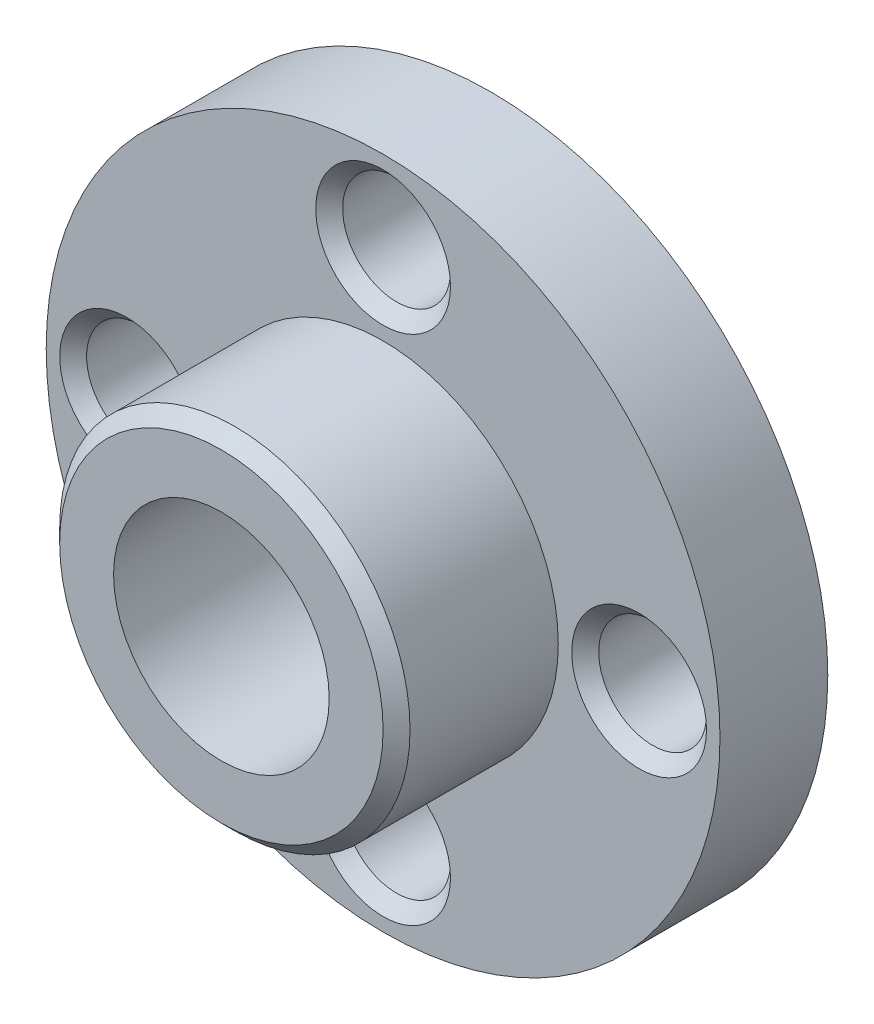
ISO-10303-21;
HEADER;
FILE_DESCRIPTION(('STEP AP214'),'2;1');
FILE_NAME('part.step','',(''),(''),'','','');
FILE_SCHEMA(('AUTOMOTIVE_DESIGN { 1 0 10303 214 1 1 1 1 }'));
ENDSEC;
DATA;
#1=APPLICATION_CONTEXT('core data for automotive mechanical design processes');
#2=APPLICATION_PROTOCOL_DEFINITION('international standard','automotive_design',2000,#1);
#3=PRODUCT_CONTEXT('',#1,'mechanical');
#4=PRODUCT('Part','Part','',(#3));
#5=PRODUCT_RELATED_PRODUCT_CATEGORY('part','',(#4));
#6=PRODUCT_DEFINITION_FORMATION('','',#4);
#7=PRODUCT_DEFINITION_CONTEXT('part definition',#1,'design');
#8=PRODUCT_DEFINITION('design','',#6,#7);
#9=PRODUCT_DEFINITION_SHAPE('','',#8);
#10=(LENGTH_UNIT() NAMED_UNIT(*) SI_UNIT(.MILLI.,.METRE.));
#11=(NAMED_UNIT(*) PLANE_ANGLE_UNIT() SI_UNIT($,.RADIAN.));
#12=(NAMED_UNIT(*) SI_UNIT($,.STERADIAN.) SOLID_ANGLE_UNIT());
#13=UNCERTAINTY_MEASURE_WITH_UNIT(LENGTH_MEASURE(1.E-05),#10,'distance_accuracy_value','');
#14=(GEOMETRIC_REPRESENTATION_CONTEXT(3) GLOBAL_UNCERTAINTY_ASSIGNED_CONTEXT((#13)) GLOBAL_UNIT_ASSIGNED_CONTEXT((#10,
#11,#12)) REPRESENTATION_CONTEXT('',''));
#15=CARTESIAN_POINT('',(0.,0.,0.));
#16=DIRECTION('',(0.,0.,1.));
#17=DIRECTION('',(1.,0.,0.));
#18=AXIS2_PLACEMENT_3D('',#15,#16,#17);
#19=CARTESIAN_POINT('',(0.,0.,9.50000000000273));
#20=DIRECTION('',(0.,0.,-1.));
#21=DIRECTION('',(-1.,0.,0.));
#22=AXIS2_PLACEMENT_3D('',#19,#20,#21);
#23=CONICAL_SURFACE('',#22,6.50000000001683,0.785398163397448);
#24=CARTESIAN_POINT('',(0.,0.,9.5));
#25=DIRECTION('',(0.,0.,1.));
#26=DIRECTION('',(1.,0.,0.));
#27=AXIS2_PLACEMENT_3D('',#24,#25,#26);
#28=CIRCLE('',#27,6.5);
#29=CARTESIAN_POINT('',(6.5,0.,9.5));
#30=VERTEX_POINT('',#29);
#31=EDGE_CURVE('E42',#30,#30,#28,.F.);
#32=ORIENTED_EDGE('',*,*,#31,.F.);
#33=EDGE_LOOP('',(#32));
#34=FACE_BOUND('',#33,.T.);
#35=CARTESIAN_POINT('',(0.,0.,9.99999999999091));
#36=DIRECTION('',(0.,0.,-1.));
#37=DIRECTION('',(-1.,0.,0.));
#38=AXIS2_PLACEMENT_3D('',#35,#36,#37);
#39=CIRCLE('',#38,6.00000000002865);
#40=CARTESIAN_POINT('',(-6.00000000002865,0.,9.99999999999091));
#41=VERTEX_POINT('',#40);
#42=EDGE_CURVE('E25',#41,#41,#39,.F.);
#43=ORIENTED_EDGE('',*,*,#42,.F.);
#44=EDGE_LOOP('',(#43));
#45=FACE_BOUND('',#44,.T.);
#46=ADVANCED_FACE('F22',(#34,#45),#23,.T.);
#47=CARTESIAN_POINT('',(0.,0.,0.));
#48=DIRECTION('',(0.,0.,1.));
#49=DIRECTION('',(1.,0.,0.));
#50=AXIS2_PLACEMENT_3D('',#47,#48,#49);
#51=CYLINDRICAL_SURFACE('',#50,6.5);
#52=CARTESIAN_POINT('',(0.,0.,4.));
#53=DIRECTION('',(0.,0.,1.));
#54=DIRECTION('',(1.,0.,0.));
#55=AXIS2_PLACEMENT_3D('',#52,#53,#54);
#56=CIRCLE('',#55,6.5);
#57=CARTESIAN_POINT('',(6.5,0.,4.));
#58=VERTEX_POINT('',#57);
#59=EDGE_CURVE('E82',#58,#58,#56,.F.);
#60=ORIENTED_EDGE('',*,*,#59,.F.);
#61=EDGE_LOOP('',(#60));
#62=FACE_BOUND('',#61,.T.);
#63=ORIENTED_EDGE('',*,*,#31,.T.);
#64=EDGE_LOOP('',(#63));
#65=FACE_BOUND('',#64,.T.);
#66=ADVANCED_FACE('F104',(#62,#65),#51,.T.);
#67=CARTESIAN_POINT('',(9.5,0.,4.00000000007594));
#68=DIRECTION('',(0.,0.,1.));
#69=DIRECTION('',(1.,0.,0.));
#70=AXIS2_PLACEMENT_3D('',#67,#68,#69);
#71=CONICAL_SURFACE('',#70,2.5000000000573,0.785398163454292);
#72=CARTESIAN_POINT('',(9.5,0.,3.5));
#73=DIRECTION('',(0.,0.,1.));
#74=DIRECTION('',(1.,0.,0.));
#75=AXIS2_PLACEMENT_3D('',#72,#73,#74);
#76=CIRCLE('',#75,2.);
#77=CARTESIAN_POINT('',(11.5,0.,3.5));
#78=VERTEX_POINT('',#77);
#79=EDGE_CURVE('E77',#78,#78,#76,.F.);
#80=ORIENTED_EDGE('',*,*,#79,.T.);
#81=EDGE_LOOP('',(#80));
#82=FACE_BOUND('',#81,.T.);
#83=CARTESIAN_POINT('',(9.5,0.,4.00000000001637));
#84=DIRECTION('',(0.,0.,1.));
#85=DIRECTION('',(1.,0.,0.));
#86=AXIS2_PLACEMENT_3D('',#83,#84,#85);
#87=CIRCLE('',#86,2.49999999999773);
#88=CARTESIAN_POINT('',(11.9999999999977,0.,4.00000000001637));
#89=VERTEX_POINT('',#88);
#90=EDGE_CURVE('E86',#89,#89,#87,.F.);
#91=ORIENTED_EDGE('',*,*,#90,.F.);
#92=EDGE_LOOP('',(#91));
#93=FACE_BOUND('',#92,.T.);
#94=ADVANCED_FACE('F113',(#82,#93),#71,.F.);
#95=CARTESIAN_POINT('',(-9.5,0.,4.0000000000191));
#96=DIRECTION('',(0.,0.,1.));
#97=DIRECTION('',(1.,0.,0.));
#98=AXIS2_PLACEMENT_3D('',#95,#96,#97);
#99=CONICAL_SURFACE('',#98,2.49999999993815,0.785398163397448);
#100=CARTESIAN_POINT('',(-9.5,0.,3.5));
#101=DIRECTION('',(0.,0.,1.));
#102=DIRECTION('',(1.,0.,0.));
#103=AXIS2_PLACEMENT_3D('',#100,#101,#102);
#104=CIRCLE('',#103,2.);
#105=CARTESIAN_POINT('',(-7.5,0.,3.5));
#106=VERTEX_POINT('',#105);
#107=EDGE_CURVE('E72',#106,#106,#104,.F.);
#108=ORIENTED_EDGE('',*,*,#107,.T.);
#109=EDGE_LOOP('',(#108));
#110=FACE_BOUND('',#109,.T.);
#111=CARTESIAN_POINT('',(-9.5,0.,4.00000000002183));
#112=DIRECTION('',(0.,0.,1.));
#113=DIRECTION('',(1.,0.,0.));
#114=AXIS2_PLACEMENT_3D('',#111,#112,#113);
#115=CIRCLE('',#114,2.49999999994088);
#116=CARTESIAN_POINT('',(-7.00000000005912,0.,4.00000000002183));
#117=VERTEX_POINT('',#116);
#118=EDGE_CURVE('E89',#117,#117,#115,.F.);
#119=ORIENTED_EDGE('',*,*,#118,.F.);
#120=EDGE_LOOP('',(#119));
#121=FACE_BOUND('',#120,.T.);
#122=ADVANCED_FACE('F181',(#110,#121),#99,.F.);
#123=CARTESIAN_POINT('',(0.,0.,10.));
#124=DIRECTION('',(0.,0.,1.));
#125=DIRECTION('',(1.,0.,0.));
#126=AXIS2_PLACEMENT_3D('',#123,#124,#125);
#127=PLANE('',#126);
#128=CARTESIAN_POINT('',(0.,0.,10.));
#129=DIRECTION('',(0.,0.,1.));
#130=DIRECTION('',(1.,0.,0.));
#131=AXIS2_PLACEMENT_3D('',#128,#129,#130);
#132=CIRCLE('',#131,4.);
#133=CARTESIAN_POINT('',(4.,0.,10.));
#134=VERTEX_POINT('',#133);
#135=EDGE_CURVE('E67',#134,#134,#132,.F.);
#136=ORIENTED_EDGE('',*,*,#135,.T.);
#137=EDGE_LOOP('',(#136));
#138=FACE_BOUND('',#137,.T.);
#139=ORIENTED_EDGE('',*,*,#42,.T.);
#140=EDGE_LOOP('',(#139));
#141=FACE_BOUND('',#140,.T.);
#142=ADVANCED_FACE('F177',(#138,#141),#127,.T.);
#143=CARTESIAN_POINT('',(0.,-9.5,4.0000000000191));
#144=DIRECTION('',(0.,0.,1.));
#145=DIRECTION('',(1.,0.,0.));
#146=AXIS2_PLACEMENT_3D('',#143,#144,#145);
#147=CONICAL_SURFACE('',#146,2.49999999994088,0.785398163397448);
#148=CARTESIAN_POINT('',(0.,-9.5,3.5));
#149=DIRECTION('',(0.,0.,1.));
#150=DIRECTION('',(1.,0.,0.));
#151=AXIS2_PLACEMENT_3D('',#148,#149,#150);
#152=CIRCLE('',#151,2.);
#153=CARTESIAN_POINT('',(2.,-9.5,3.5));
#154=VERTEX_POINT('',#153);
#155=EDGE_CURVE('E71',#154,#154,#152,.F.);
#156=ORIENTED_EDGE('',*,*,#155,.T.);
#157=EDGE_LOOP('',(#156));
#158=FACE_BOUND('',#157,.T.);
#159=CARTESIAN_POINT('',(0.,-9.5,4.0000000000191));
#160=DIRECTION('',(0.,0.,1.));
#161=DIRECTION('',(1.,0.,0.));
#162=AXIS2_PLACEMENT_3D('',#159,#160,#161);
#163=CIRCLE('',#162,2.49999999994088);
#164=CARTESIAN_POINT('',(2.49999999994088,-9.5,4.0000000000191));
#165=VERTEX_POINT('',#164);
#166=EDGE_CURVE('E73',#165,#165,#163,.F.);
#167=ORIENTED_EDGE('',*,*,#166,.F.);
#168=EDGE_LOOP('',(#167));
#169=FACE_BOUND('',#168,.T.);
#170=ADVANCED_FACE('F173',(#158,#169),#147,.F.);
#171=CARTESIAN_POINT('',(0.,9.5,4.0000000000191));
#172=DIRECTION('',(0.,0.,1.));
#173=DIRECTION('',(1.,0.,0.));
#174=AXIS2_PLACEMENT_3D('',#171,#172,#173);
#175=CONICAL_SURFACE('',#174,2.49999999994088,0.785398163340605);
#176=CARTESIAN_POINT('',(0.,9.5,3.5));
#177=DIRECTION('',(0.,0.,1.));
#178=DIRECTION('',(1.,0.,0.));
#179=AXIS2_PLACEMENT_3D('',#176,#177,#178);
#180=CIRCLE('',#179,2.);
#181=CARTESIAN_POINT('',(2.,9.5,3.5));
#182=VERTEX_POINT('',#181);
#183=EDGE_CURVE('E66',#182,#182,#180,.F.);
#184=ORIENTED_EDGE('',*,*,#183,.T.);
#185=EDGE_LOOP('',(#184));
#186=FACE_BOUND('',#185,.T.);
#187=CARTESIAN_POINT('',(0.,9.5,4.0000000000191));
#188=DIRECTION('',(0.,0.,1.));
#189=DIRECTION('',(1.,0.,0.));
#190=AXIS2_PLACEMENT_3D('',#187,#188,#189);
#191=CIRCLE('',#190,2.49999999994088);
#192=CARTESIAN_POINT('',(2.49999999994088,9.5,4.0000000000191));
#193=VERTEX_POINT('',#192);
#194=EDGE_CURVE('E78',#193,#193,#191,.F.);
#195=ORIENTED_EDGE('',*,*,#194,.F.);
#196=EDGE_LOOP('',(#195));
#197=FACE_BOUND('',#196,.T.);
#198=ADVANCED_FACE('F169',(#186,#197),#175,.F.);
#199=CARTESIAN_POINT('',(0.,0.,4.));
#200=DIRECTION('',(0.,0.,1.));
#201=DIRECTION('',(1.,0.,0.));
#202=AXIS2_PLACEMENT_3D('',#199,#200,#201);
#203=PLANE('',#202);
#204=ORIENTED_EDGE('',*,*,#166,.T.);
#205=EDGE_LOOP('',(#204));
#206=FACE_BOUND('',#205,.T.);
#207=ORIENTED_EDGE('',*,*,#194,.T.);
#208=EDGE_LOOP('',(#207));
#209=FACE_BOUND('',#208,.T.);
#210=ORIENTED_EDGE('',*,*,#59,.T.);
#211=EDGE_LOOP('',(#210));
#212=FACE_BOUND('',#211,.T.);
#213=ORIENTED_EDGE('',*,*,#90,.T.);
#214=EDGE_LOOP('',(#213));
#215=FACE_BOUND('',#214,.T.);
#216=ORIENTED_EDGE('',*,*,#118,.T.);
#217=EDGE_LOOP('',(#216));
#218=FACE_BOUND('',#217,.T.);
#219=CARTESIAN_POINT('',(0.,0.,4.));
#220=DIRECTION('',(0.,0.,1.));
#221=DIRECTION('',(1.,0.,0.));
#222=AXIS2_PLACEMENT_3D('',#219,#220,#221);
#223=CIRCLE('',#222,12.5);
#224=CARTESIAN_POINT('',(12.5,0.,4.));
#225=VERTEX_POINT('',#224);
#226=EDGE_CURVE('E61',#225,#225,#223,.F.);
#227=ORIENTED_EDGE('',*,*,#226,.F.);
#228=EDGE_LOOP('',(#227));
#229=FACE_BOUND('',#228,.T.);
#230=ADVANCED_FACE('F165',(#206,#209,#212,#215,#218,#229),#203,.T.);
#231=CARTESIAN_POINT('',(9.5,0.,0.));
#232=DIRECTION('',(0.,0.,1.));
#233=DIRECTION('',(1.,0.,0.));
#234=AXIS2_PLACEMENT_3D('',#231,#232,#233);
#235=CYLINDRICAL_SURFACE('',#234,2.);
#236=CARTESIAN_POINT('',(9.5,0.,0.499999999988177));
#237=DIRECTION('',(0.,0.,-1.));
#238=DIRECTION('',(1.,0.,0.));
#239=AXIS2_PLACEMENT_3D('',#236,#237,#238);
#240=CIRCLE('',#239,1.99999999995543);
#241=CARTESIAN_POINT('',(11.4999999999554,0.,0.499999999988177));
#242=VERTEX_POINT('',#241);
#243=EDGE_CURVE('E65',#242,#242,#240,.T.);
#244=ORIENTED_EDGE('',*,*,#243,.T.);
#245=EDGE_LOOP('',(#244));
#246=FACE_BOUND('',#245,.T.);
#247=ORIENTED_EDGE('',*,*,#79,.F.);
#248=EDGE_LOOP('',(#247));
#249=FACE_BOUND('',#248,.T.);
#250=ADVANCED_FACE('F161',(#246,#249),#235,.F.);
#251=CARTESIAN_POINT('',(-9.5,0.,0.));
#252=DIRECTION('',(0.,0.,1.));
#253=DIRECTION('',(1.,0.,0.));
#254=AXIS2_PLACEMENT_3D('',#251,#252,#253);
#255=CYLINDRICAL_SURFACE('',#254,2.);
#256=CARTESIAN_POINT('',(-9.5,0.,0.499999999988177));
#257=DIRECTION('',(0.,0.,-1.));
#258=DIRECTION('',(1.,0.,0.));
#259=AXIS2_PLACEMENT_3D('',#256,#257,#258);
#260=CIRCLE('',#259,1.99999999994998);
#261=CARTESIAN_POINT('',(-7.50000000005002,0.,0.499999999988177));
#262=VERTEX_POINT('',#261);
#263=EDGE_CURVE('E204',#262,#262,#260,.T.);
#264=ORIENTED_EDGE('',*,*,#263,.T.);
#265=EDGE_LOOP('',(#264));
#266=FACE_BOUND('',#265,.T.);
#267=ORIENTED_EDGE('',*,*,#107,.F.);
#268=EDGE_LOOP('',(#267));
#269=FACE_BOUND('',#268,.T.);
#270=ADVANCED_FACE('F157',(#266,#269),#255,.F.);
#271=CARTESIAN_POINT('',(0.,0.,0.));
#272=DIRECTION('',(0.,0.,1.));
#273=DIRECTION('',(1.,0.,0.));
#274=AXIS2_PLACEMENT_3D('',#271,#272,#273);
#275=CYLINDRICAL_SURFACE('',#274,4.);
#276=CARTESIAN_POINT('',(0.,0.,0.50000000004502));
#277=DIRECTION('',(0.,0.,-1.));
#278=DIRECTION('',(1.,0.,0.));
#279=AXIS2_PLACEMENT_3D('',#276,#277,#278);
#280=CIRCLE('',#279,3.99999999996226);
#281=CARTESIAN_POINT('',(3.99999999996226,0.,0.50000000004502));
#282=VERTEX_POINT('',#281);
#283=EDGE_CURVE('E209',#282,#282,#280,.T.);
#284=ORIENTED_EDGE('',*,*,#283,.T.);
#285=EDGE_LOOP('',(#284));
#286=FACE_BOUND('',#285,.T.);
#287=ORIENTED_EDGE('',*,*,#135,.F.);
#288=EDGE_LOOP('',(#287));
#289=FACE_BOUND('',#288,.T.);
#290=ADVANCED_FACE('F153',(#286,#289),#275,.F.);
#291=CARTESIAN_POINT('',(0.,-9.5,0.));
#292=DIRECTION('',(0.,0.,1.));
#293=DIRECTION('',(1.,0.,0.));
#294=AXIS2_PLACEMENT_3D('',#291,#292,#293);
#295=CYLINDRICAL_SURFACE('',#294,2.);
#296=CARTESIAN_POINT('',(0.,-9.5,0.499999999988177));
#297=DIRECTION('',(0.,0.,-1.));
#298=DIRECTION('',(1.,0.,0.));
#299=AXIS2_PLACEMENT_3D('',#296,#297,#298);
#300=CIRCLE('',#299,2.00000000000955);
#301=CARTESIAN_POINT('',(2.00000000000955,-9.5,0.499999999988177));
#302=VERTEX_POINT('',#301);
#303=EDGE_CURVE('E213',#302,#302,#300,.T.);
#304=ORIENTED_EDGE('',*,*,#303,.T.);
#305=EDGE_LOOP('',(#304));
#306=FACE_BOUND('',#305,.T.);
#307=ORIENTED_EDGE('',*,*,#155,.F.);
#308=EDGE_LOOP('',(#307));
#309=FACE_BOUND('',#308,.T.);
#310=ADVANCED_FACE('F149',(#306,#309),#295,.F.);
#311=CARTESIAN_POINT('',(0.,9.5,0.));
#312=DIRECTION('',(0.,0.,1.));
#313=DIRECTION('',(1.,0.,0.));
#314=AXIS2_PLACEMENT_3D('',#311,#312,#313);
#315=CYLINDRICAL_SURFACE('',#314,2.);
#316=CARTESIAN_POINT('',(0.,9.5,0.50000000004502));
#317=DIRECTION('',(0.,0.,-1.));
#318=DIRECTION('',(1.,0.,0.));
#319=AXIS2_PLACEMENT_3D('',#316,#317,#318);
#320=CIRCLE('',#319,1.99999999995271);
#321=CARTESIAN_POINT('',(1.99999999995271,9.5,0.50000000004502));
#322=VERTEX_POINT('',#321);
#323=EDGE_CURVE('E60',#322,#322,#320,.T.);
#324=ORIENTED_EDGE('',*,*,#323,.T.);
#325=EDGE_LOOP('',(#324));
#326=FACE_BOUND('',#325,.T.);
#327=ORIENTED_EDGE('',*,*,#183,.F.);
#328=EDGE_LOOP('',(#327));
#329=FACE_BOUND('',#328,.T.);
#330=ADVANCED_FACE('F145',(#326,#329),#315,.F.);
#331=CARTESIAN_POINT('',(0.,0.,0.));
#332=DIRECTION('',(0.,0.,1.));
#333=DIRECTION('',(1.,0.,0.));
#334=AXIS2_PLACEMENT_3D('',#331,#332,#333);
#335=CYLINDRICAL_SURFACE('',#334,12.5);
#336=CARTESIAN_POINT('',(0.,0.,0.));
#337=DIRECTION('',(0.,0.,1.));
#338=DIRECTION('',(1.,0.,0.));
#339=AXIS2_PLACEMENT_3D('',#336,#337,#338);
#340=CIRCLE('',#339,12.5);
#341=CARTESIAN_POINT('',(12.5,0.,0.));
#342=VERTEX_POINT('',#341);
#343=EDGE_CURVE('E56',#342,#342,#340,.T.);
#344=ORIENTED_EDGE('',*,*,#343,.T.);
#345=EDGE_LOOP('',(#344));
#346=FACE_BOUND('',#345,.T.);
#347=ORIENTED_EDGE('',*,*,#226,.T.);
#348=EDGE_LOOP('',(#347));
#349=FACE_BOUND('',#348,.T.);
#350=ADVANCED_FACE('F141',(#346,#349),#335,.T.);
#351=CARTESIAN_POINT('',(9.5,0.,0.));
#352=DIRECTION('',(0.,0.,-1.));
#353=DIRECTION('',(-1.,0.,0.));
#354=AXIS2_PLACEMENT_3D('',#351,#352,#353);
#355=CONICAL_SURFACE('',#354,2.50000000000046,0.785398163454292);
#356=CARTESIAN_POINT('',(9.5,0.,2.7287200274013E-12));
#357=DIRECTION('',(0.,0.,-1.));
#358=DIRECTION('',(-1.,0.,0.));
#359=AXIS2_PLACEMENT_3D('',#356,#357,#358);
#360=CIRCLE('',#359,2.49999999999773);
#361=CARTESIAN_POINT('',(7.00000000000227,0.,2.7287200274013E-12));
#362=VERTEX_POINT('',#361);
#363=EDGE_CURVE('E52',#362,#362,#360,.T.);
#364=ORIENTED_EDGE('',*,*,#363,.T.);
#365=EDGE_LOOP('',(#364));
#366=FACE_BOUND('',#365,.T.);
#367=ORIENTED_EDGE('',*,*,#243,.F.);
#368=EDGE_LOOP('',(#367));
#369=FACE_BOUND('',#368,.T.);
#370=ADVANCED_FACE('F137',(#366,#369),#355,.F.);
#371=CARTESIAN_POINT('',(-9.5,0.,0.));
#372=DIRECTION('',(0.,0.,-1.));
#373=DIRECTION('',(-1.,0.,0.));
#374=AXIS2_PLACEMENT_3D('',#371,#372,#373);
#375=CONICAL_SURFACE('',#374,2.499999999995,0.785398163454292);
#376=CARTESIAN_POINT('',(-9.5,0.,-2.7287200274013E-12));
#377=DIRECTION('',(0.,0.,-1.));
#378=DIRECTION('',(-1.,0.,0.));
#379=AXIS2_PLACEMENT_3D('',#376,#377,#378);
#380=CIRCLE('',#379,2.49999999999773);
#381=CARTESIAN_POINT('',(-11.9999999999977,0.,-2.7287200274013E-12));
#382=VERTEX_POINT('',#381);
#383=EDGE_CURVE('E48',#382,#382,#380,.T.);
#384=ORIENTED_EDGE('',*,*,#383,.T.);
#385=EDGE_LOOP('',(#384));
#386=FACE_BOUND('',#385,.T.);
#387=ORIENTED_EDGE('',*,*,#263,.F.);
#388=EDGE_LOOP('',(#387));
#389=FACE_BOUND('',#388,.T.);
#390=ADVANCED_FACE('F133',(#386,#389),#375,.F.);
#391=CARTESIAN_POINT('',(0.,0.,0.));
#392=DIRECTION('',(0.,0.,-1.));
#393=DIRECTION('',(-1.,0.,0.));
#394=AXIS2_PLACEMENT_3D('',#391,#392,#393);
#395=CONICAL_SURFACE('',#394,4.50000000000728,0.785398163397448);
#396=CARTESIAN_POINT('',(0.,0.,0.));
#397=DIRECTION('',(0.,0.,-1.));
#398=DIRECTION('',(-1.,0.,0.));
#399=AXIS2_PLACEMENT_3D('',#396,#397,#398);
#400=CIRCLE('',#399,4.50000000000728);
#401=CARTESIAN_POINT('',(-4.50000000000728,0.,0.));
#402=VERTEX_POINT('',#401);
#403=EDGE_CURVE('E39',#402,#402,#400,.T.);
#404=ORIENTED_EDGE('',*,*,#403,.T.);
#405=EDGE_LOOP('',(#404));
#406=FACE_BOUND('',#405,.T.);
#407=ORIENTED_EDGE('',*,*,#283,.F.);
#408=EDGE_LOOP('',(#407));
#409=FACE_BOUND('',#408,.T.);
#410=ADVANCED_FACE('F130',(#406,#409),#395,.F.);
#411=CARTESIAN_POINT('',(0.,-9.5,5.6843418860808E-11));
#412=DIRECTION('',(0.,0.,-1.));
#413=DIRECTION('',(-1.,0.,0.));
#414=AXIS2_PLACEMENT_3D('',#411,#412,#413);
#415=CONICAL_SURFACE('',#414,2.49999999988404,0.785398163397448);
#416=CARTESIAN_POINT('',(0.,-9.5,-5.6843418860808E-11));
#417=DIRECTION('',(0.,0.,-1.));
#418=DIRECTION('',(-1.,0.,0.));
#419=AXIS2_PLACEMENT_3D('',#416,#417,#418);
#420=CIRCLE('',#419,2.49999999999773);
#421=CARTESIAN_POINT('',(-2.49999999999773,-9.5,-5.6843418860808E-11));
#422=VERTEX_POINT('',#421);
#423=EDGE_CURVE('E30',#422,#422,#420,.T.);
#424=ORIENTED_EDGE('',*,*,#423,.T.);
#425=EDGE_LOOP('',(#424));
#426=FACE_BOUND('',#425,.T.);
#427=ORIENTED_EDGE('',*,*,#303,.F.);
#428=EDGE_LOOP('',(#427));
#429=FACE_BOUND('',#428,.T.);
#430=ADVANCED_FACE('F124',(#426,#429),#415,.F.);
#431=CARTESIAN_POINT('',(0.,9.5,-5.6843418860808E-11));
#432=DIRECTION('',(0.,0.,-1.));
#433=DIRECTION('',(-1.,0.,0.));
#434=AXIS2_PLACEMENT_3D('',#431,#432,#433);
#435=CONICAL_SURFACE('',#434,2.50000000005457,0.785398163397448);
#436=CARTESIAN_POINT('',(0.,9.5,5.6843418860808E-11));
#437=DIRECTION('',(0.,0.,-1.));
#438=DIRECTION('',(-1.,0.,0.));
#439=AXIS2_PLACEMENT_3D('',#436,#437,#438);
#440=CIRCLE('',#439,2.49999999994088);
#441=CARTESIAN_POINT('',(-2.49999999994088,9.5,5.6843418860808E-11));
#442=VERTEX_POINT('',#441);
#443=EDGE_CURVE('E12',#442,#442,#440,.T.);
#444=ORIENTED_EDGE('',*,*,#443,.T.);
#445=EDGE_LOOP('',(#444));
#446=FACE_BOUND('',#445,.T.);
#447=ORIENTED_EDGE('',*,*,#323,.F.);
#448=EDGE_LOOP('',(#447));
#449=FACE_BOUND('',#448,.T.);
#450=ADVANCED_FACE('F117',(#446,#449),#435,.F.);
#451=CARTESIAN_POINT('',(0.,0.,0.));
#452=DIRECTION('',(0.,0.,1.));
#453=DIRECTION('',(1.,0.,0.));
#454=AXIS2_PLACEMENT_3D('',#451,#452,#453);
#455=PLANE('',#454);
#456=ORIENTED_EDGE('',*,*,#443,.F.);
#457=EDGE_LOOP('',(#456));
#458=FACE_BOUND('',#457,.T.);
#459=ORIENTED_EDGE('',*,*,#423,.F.);
#460=EDGE_LOOP('',(#459));
#461=FACE_BOUND('',#460,.T.);
#462=ORIENTED_EDGE('',*,*,#403,.F.);
#463=EDGE_LOOP('',(#462));
#464=FACE_BOUND('',#463,.T.);
#465=ORIENTED_EDGE('',*,*,#383,.F.);
#466=EDGE_LOOP('',(#465));
#467=FACE_BOUND('',#466,.T.);
#468=ORIENTED_EDGE('',*,*,#363,.F.);
#469=EDGE_LOOP('',(#468));
#470=FACE_BOUND('',#469,.T.);
#471=ORIENTED_EDGE('',*,*,#343,.F.);
#472=EDGE_LOOP('',(#471));
#473=FACE_BOUND('',#472,.T.);
#474=ADVANCED_FACE('F115',(#458,#461,#464,#467,#470,#473),#455,.F.);
#475=CLOSED_SHELL('',(#46,#66,#94,#122,#142,#170,#198,#230,#250,#270,#290,#310,#330,#350,#370,
#390,#410,#430,#450,#474));
#476=MANIFOLD_SOLID_BREP('B1',#475);
#477=ADVANCED_BREP_SHAPE_REPRESENTATION('',(#18,#476),#14);
#478=SHAPE_DEFINITION_REPRESENTATION(#9,#477);
ENDSEC;
END-ISO-10303-21;
